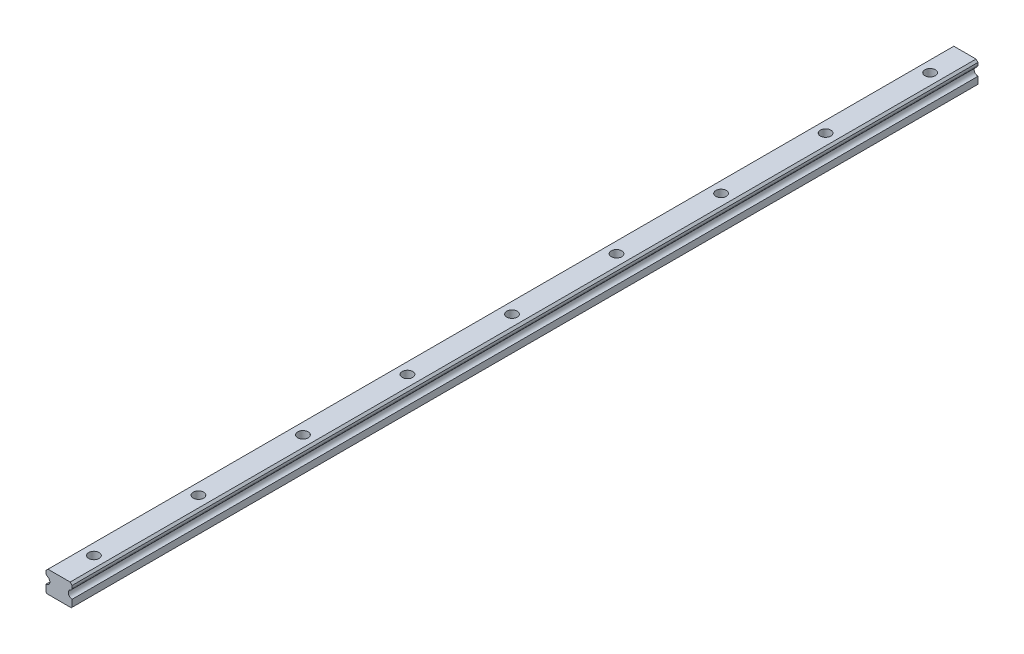
ISO-10303-21;
HEADER;
FILE_DESCRIPTION(('STEP AP214'),'2;1');
FILE_NAME('part.step','',(''),(''),'','','');
FILE_SCHEMA(('AUTOMOTIVE_DESIGN { 1 0 10303 214 1 1 1 1 }'));
ENDSEC;
DATA;
#1=APPLICATION_CONTEXT('core data for automotive mechanical design processes');
#2=APPLICATION_PROTOCOL_DEFINITION('international standard','automotive_design',2000,#1);
#3=PRODUCT_CONTEXT('',#1,'mechanical');
#4=PRODUCT('Part','Part','',(#3));
#5=PRODUCT_RELATED_PRODUCT_CATEGORY('part','',(#4));
#6=PRODUCT_DEFINITION_FORMATION('','',#4);
#7=PRODUCT_DEFINITION_CONTEXT('part definition',#1,'design');
#8=PRODUCT_DEFINITION('design','',#6,#7);
#9=PRODUCT_DEFINITION_SHAPE('','',#8);
#10=(LENGTH_UNIT() NAMED_UNIT(*) SI_UNIT(.MILLI.,.METRE.));
#11=(NAMED_UNIT(*) PLANE_ANGLE_UNIT() SI_UNIT($,.RADIAN.));
#12=(NAMED_UNIT(*) SI_UNIT($,.STERADIAN.) SOLID_ANGLE_UNIT());
#13=UNCERTAINTY_MEASURE_WITH_UNIT(LENGTH_MEASURE(1.E-05),#10,'distance_accuracy_value','');
#14=(GEOMETRIC_REPRESENTATION_CONTEXT(3) GLOBAL_UNCERTAINTY_ASSIGNED_CONTEXT((#13)) GLOBAL_UNIT_ASSIGNED_CONTEXT((#10,
#11,#12)) REPRESENTATION_CONTEXT('',''));
#15=CARTESIAN_POINT('',(0.,0.,0.));
#16=DIRECTION('',(0.,0.,1.));
#17=DIRECTION('',(1.,0.,0.));
#18=AXIS2_PLACEMENT_3D('',#15,#16,#17);
#19=CARTESIAN_POINT('',(-7.5,4.505,260.));
#20=DIRECTION('',(1.,0.,0.));
#21=DIRECTION('',(0.,0.,-1.));
#22=AXIS2_PLACEMENT_3D('',#19,#20,#21);
#23=PLANE('',#22);
#24=DIRECTION('',(0.,-1.,0.));
#25=VECTOR('',#24,1.);
#26=CARTESIAN_POINT('',(-7.5,4.505,-260.));
#27=LINE('',#26,#25);
#28=CARTESIAN_POINT('',(-7.5,4.505,-260.));
#29=VERTEX_POINT('',#28);
#30=CARTESIAN_POINT('',(-7.5,0.5,-260.));
#31=VERTEX_POINT('',#30);
#32=EDGE_CURVE('E131',#29,#31,#27,.T.);
#33=ORIENTED_EDGE('',*,*,#32,.T.);
#34=DIRECTION('',(0.,0.,-1.));
#35=VECTOR('',#34,1.);
#36=CARTESIAN_POINT('',(-7.5,0.5,260.));
#37=LINE('',#36,#35);
#38=CARTESIAN_POINT('',(-7.5,0.5,260.));
#39=VERTEX_POINT('',#38);
#40=EDGE_CURVE('E120',#39,#31,#37,.T.);
#41=ORIENTED_EDGE('',*,*,#40,.F.);
#42=DIRECTION('',(0.,-1.,0.));
#43=VECTOR('',#42,1.);
#44=CARTESIAN_POINT('',(-7.5,4.505,260.));
#45=LINE('',#44,#43);
#46=CARTESIAN_POINT('',(-7.5,4.505,260.));
#47=VERTEX_POINT('',#46);
#48=EDGE_CURVE('E130',#47,#39,#45,.T.);
#49=ORIENTED_EDGE('',*,*,#48,.F.);
#50=DIRECTION('',(0.,0.,-1.));
#51=VECTOR('',#50,1.);
#52=CARTESIAN_POINT('',(-7.5,4.505,260.));
#53=LINE('',#52,#51);
#54=EDGE_CURVE('E143',#47,#29,#53,.T.);
#55=ORIENTED_EDGE('',*,*,#54,.T.);
#56=EDGE_LOOP('',(#33,#41,#49,#55));
#57=FACE_BOUND('',#56,.T.);
#58=ADVANCED_FACE('F16',(#57),#23,.F.);
#59=CARTESIAN_POINT('',(7.5,6.705,-260.));
#60=DIRECTION('',(0.,0.,1.));
#61=DIRECTION('',(1.,0.,0.));
#62=AXIS2_PLACEMENT_3D('',#59,#60,#61);
#63=PLANE('',#62);
#64=ORIENTED_EDGE('',*,*,#32,.F.);
#65=CARTESIAN_POINT('',(-7.5,6.705,-260.));
#66=DIRECTION('',(0.,0.,1.));
#67=DIRECTION('',(0.,-1.,0.));
#68=AXIS2_PLACEMENT_3D('',#65,#66,#67);
#69=CIRCLE('',#68,2.2);
#70=CARTESIAN_POINT('',(-6.6081080888441,8.7161013944639,-260.));
#71=VERTEX_POINT('',#70);
#72=EDGE_CURVE('E154',#29,#71,#69,.T.);
#73=ORIENTED_EDGE('',*,*,#72,.T.);
#74=CARTESIAN_POINT('',(-6.00000000000026,10.0873069050574,-260.));
#75=DIRECTION('',(0.,0.,1.));
#76=DIRECTION('',(-1.,4.13299024633863E-13,0.));
#77=AXIS2_PLACEMENT_3D('',#74,#75,#76);
#78=CIRCLE('',#77,1.49999999999974);
#79=CARTESIAN_POINT('',(-7.5,10.087306905058,-260.));
#80=VERTEX_POINT('',#79);
#81=EDGE_CURVE('E158',#80,#71,#78,.T.);
#82=ORIENTED_EDGE('',*,*,#81,.F.);
#83=DIRECTION('',(0.,-1.,0.));
#84=VECTOR('',#83,1.);
#85=CARTESIAN_POINT('',(-7.5,11.375700217913,-260.));
#86=LINE('',#85,#84);
#87=CARTESIAN_POINT('',(-7.5,11.375700217913,-260.));
#88=VERTEX_POINT('',#87);
#89=EDGE_CURVE('E162',#88,#80,#86,.T.);
#90=ORIENTED_EDGE('',*,*,#89,.F.);
#91=DIRECTION('',(-0.707106781186422,-0.707106781186673,0.));
#92=VECTOR('',#91,1.);
#93=CARTESIAN_POINT('',(-6.3757002179134,12.5,-260.));
#94=LINE('',#93,#92);
#95=CARTESIAN_POINT('',(-6.3757002179134,12.5,-260.));
#96=VERTEX_POINT('',#95);
#97=EDGE_CURVE('E166',#96,#88,#94,.T.);
#98=ORIENTED_EDGE('',*,*,#97,.F.);
#99=DIRECTION('',(-1.,0.,0.));
#100=VECTOR('',#99,1.);
#101=CARTESIAN_POINT('',(6.3757002179134,12.5,-260.));
#102=LINE('',#101,#100);
#103=CARTESIAN_POINT('',(6.3757002179134,12.5,-260.));
#104=VERTEX_POINT('',#103);
#105=EDGE_CURVE('E170',#104,#96,#102,.T.);
#106=ORIENTED_EDGE('',*,*,#105,.F.);
#107=DIRECTION('',(-0.707106781186422,0.707106781186673,0.));
#108=VECTOR('',#107,1.);
#109=CARTESIAN_POINT('',(7.5,11.375700217913,-260.));
#110=LINE('',#109,#108);
#111=CARTESIAN_POINT('',(7.5,11.375700217913,-260.));
#112=VERTEX_POINT('',#111);
#113=EDGE_CURVE('E174',#112,#104,#110,.T.);
#114=ORIENTED_EDGE('',*,*,#113,.F.);
#115=DIRECTION('',(0.,1.,0.));
#116=VECTOR('',#115,1.);
#117=CARTESIAN_POINT('',(7.5,10.087306905058,-260.));
#118=LINE('',#117,#116);
#119=CARTESIAN_POINT('',(7.5,10.087306905058,-260.));
#120=VERTEX_POINT('',#119);
#121=EDGE_CURVE('E178',#120,#112,#118,.T.);
#122=ORIENTED_EDGE('',*,*,#121,.F.);
#123=CARTESIAN_POINT('',(6.00000000000021,10.0873069050574,-260.));
#124=DIRECTION('',(0.,0.,1.));
#125=DIRECTION('',(0.405405379719981,-0.914137012757988,0.));
#126=AXIS2_PLACEMENT_3D('',#123,#124,#125);
#127=CIRCLE('',#126,1.49999999999979);
#128=CARTESIAN_POINT('',(6.6081080695801,8.7161013859206,-260.));
#129=VERTEX_POINT('',#128);
#130=EDGE_CURVE('E182',#129,#120,#127,.T.);
#131=ORIENTED_EDGE('',*,*,#130,.F.);
#132=CARTESIAN_POINT('',(7.5,6.705,-260.));
#133=DIRECTION('',(0.,0.,1.));
#134=DIRECTION('',(-0.40540542291814,0.914136993600283,0.));
#135=AXIS2_PLACEMENT_3D('',#132,#133,#134);
#136=CIRCLE('',#135,2.2);
#137=CARTESIAN_POINT('',(7.5,4.505,-260.));
#138=VERTEX_POINT('',#137);
#139=EDGE_CURVE('E186',#129,#138,#136,.T.);
#140=ORIENTED_EDGE('',*,*,#139,.T.);
#141=DIRECTION('',(0.,1.,0.));
#142=VECTOR('',#141,1.);
#143=CARTESIAN_POINT('',(7.5,0.5,-260.));
#144=LINE('',#143,#142);
#145=CARTESIAN_POINT('',(7.5,0.5,-260.));
#146=VERTEX_POINT('',#145);
#147=EDGE_CURVE('E191',#146,#138,#144,.T.);
#148=ORIENTED_EDGE('',*,*,#147,.F.);
#149=DIRECTION('',(0.707106781186547,0.707106781186548,0.));
#150=VECTOR('',#149,1.);
#151=CARTESIAN_POINT('',(7.,0.,-260.));
#152=LINE('',#151,#150);
#153=CARTESIAN_POINT('',(7.,0.,-260.));
#154=VERTEX_POINT('',#153);
#155=EDGE_CURVE('E195',#154,#146,#152,.T.);
#156=ORIENTED_EDGE('',*,*,#155,.F.);
#157=DIRECTION('',(1.,0.,0.));
#158=VECTOR('',#157,1.);
#159=CARTESIAN_POINT('',(-7.,0.,-260.));
#160=LINE('',#159,#158);
#161=CARTESIAN_POINT('',(-7.,0.,-260.));
#162=VERTEX_POINT('',#161);
#163=EDGE_CURVE('E139',#162,#154,#160,.T.);
#164=ORIENTED_EDGE('',*,*,#163,.F.);
#165=DIRECTION('',(0.707106781186547,-0.707106781186548,0.));
#166=VECTOR('',#165,1.);
#167=CARTESIAN_POINT('',(-7.5,0.5,-260.));
#168=LINE('',#167,#166);
#169=EDGE_CURVE('E124',#31,#162,#168,.T.);
#170=ORIENTED_EDGE('',*,*,#169,.F.);
#171=EDGE_LOOP('',(#64,#73,#82,#90,#98,#106,#114,#122,#131,#140,#148,#156,#164,#170));
#172=FACE_BOUND('',#171,.T.);
#173=ADVANCED_FACE('F136',(#172),#63,.F.);
#174=CARTESIAN_POINT('',(-7.5,0.5,260.));
#175=DIRECTION('',(0.707106781186548,0.707106781186547,0.));
#176=DIRECTION('',(-0.707106781186547,0.707106781186548,0.));
#177=AXIS2_PLACEMENT_3D('',#174,#175,#176);
#178=PLANE('',#177);
#179=ORIENTED_EDGE('',*,*,#169,.T.);
#180=DIRECTION('',(0.,0.,-1.));
#181=VECTOR('',#180,1.);
#182=CARTESIAN_POINT('',(-7.,0.,260.));
#183=LINE('',#182,#181);
#184=CARTESIAN_POINT('',(-7.,0.,260.));
#185=VERTEX_POINT('',#184);
#186=EDGE_CURVE('E140',#185,#162,#183,.T.);
#187=ORIENTED_EDGE('',*,*,#186,.F.);
#188=DIRECTION('',(0.707106781186547,-0.707106781186548,0.));
#189=VECTOR('',#188,1.);
#190=CARTESIAN_POINT('',(-7.5,0.5,260.));
#191=LINE('',#190,#189);
#192=EDGE_CURVE('E126',#39,#185,#191,.T.);
#193=ORIENTED_EDGE('',*,*,#192,.F.);
#194=ORIENTED_EDGE('',*,*,#40,.T.);
#195=EDGE_LOOP('',(#179,#187,#193,#194));
#196=FACE_BOUND('',#195,.T.);
#197=ADVANCED_FACE('F122',(#196),#178,.F.);
#198=CARTESIAN_POINT('',(7.5,6.705,260.));
#199=DIRECTION('',(0.,0.,1.));
#200=DIRECTION('',(1.,0.,0.));
#201=AXIS2_PLACEMENT_3D('',#198,#199,#200);
#202=PLANE('',#201);
#203=ORIENTED_EDGE('',*,*,#48,.T.);
#204=ORIENTED_EDGE('',*,*,#192,.T.);
#205=DIRECTION('',(1.,0.,0.));
#206=VECTOR('',#205,1.);
#207=CARTESIAN_POINT('',(-7.,0.,260.));
#208=LINE('',#207,#206);
#209=CARTESIAN_POINT('',(7.,0.,260.));
#210=VERTEX_POINT('',#209);
#211=EDGE_CURVE('E210',#185,#210,#208,.T.);
#212=ORIENTED_EDGE('',*,*,#211,.T.);
#213=DIRECTION('',(0.707106781186547,0.707106781186548,0.));
#214=VECTOR('',#213,1.);
#215=CARTESIAN_POINT('',(7.,0.,260.));
#216=LINE('',#215,#214);
#217=CARTESIAN_POINT('',(7.5,0.5,260.));
#218=VERTEX_POINT('',#217);
#219=EDGE_CURVE('E215',#210,#218,#216,.T.);
#220=ORIENTED_EDGE('',*,*,#219,.T.);
#221=DIRECTION('',(0.,1.,0.));
#222=VECTOR('',#221,1.);
#223=CARTESIAN_POINT('',(7.5,0.5,260.));
#224=LINE('',#223,#222);
#225=CARTESIAN_POINT('',(7.5,4.505,260.));
#226=VERTEX_POINT('',#225);
#227=EDGE_CURVE('E220',#218,#226,#224,.T.);
#228=ORIENTED_EDGE('',*,*,#227,.T.);
#229=CARTESIAN_POINT('',(7.5,6.705,260.));
#230=DIRECTION('',(0.,0.,1.));
#231=DIRECTION('',(-0.40540542291814,0.914136993600283,0.));
#232=AXIS2_PLACEMENT_3D('',#229,#230,#231);
#233=CIRCLE('',#232,2.2);
#234=CARTESIAN_POINT('',(6.6081080695801,8.7161013859206,260.));
#235=VERTEX_POINT('',#234);
#236=EDGE_CURVE('E225',#235,#226,#233,.T.);
#237=ORIENTED_EDGE('',*,*,#236,.F.);
#238=CARTESIAN_POINT('',(6.00000000000021,10.0873069050574,260.));
#239=DIRECTION('',(0.,0.,1.));
#240=DIRECTION('',(0.405405379719981,-0.914137012757988,0.));
#241=AXIS2_PLACEMENT_3D('',#238,#239,#240);
#242=CIRCLE('',#241,1.49999999999979);
#243=CARTESIAN_POINT('',(7.5,10.087306905058,260.));
#244=VERTEX_POINT('',#243);
#245=EDGE_CURVE('E230',#235,#244,#242,.T.);
#246=ORIENTED_EDGE('',*,*,#245,.T.);
#247=DIRECTION('',(0.,1.,0.));
#248=VECTOR('',#247,1.);
#249=CARTESIAN_POINT('',(7.5,10.087306905058,260.));
#250=LINE('',#249,#248);
#251=CARTESIAN_POINT('',(7.5,11.375700217913,260.));
#252=VERTEX_POINT('',#251);
#253=EDGE_CURVE('E235',#244,#252,#250,.T.);
#254=ORIENTED_EDGE('',*,*,#253,.T.);
#255=DIRECTION('',(-0.707106781186422,0.707106781186673,0.));
#256=VECTOR('',#255,1.);
#257=CARTESIAN_POINT('',(7.5,11.375700217913,260.));
#258=LINE('',#257,#256);
#259=CARTESIAN_POINT('',(6.3757002179134,12.5,260.));
#260=VERTEX_POINT('',#259);
#261=EDGE_CURVE('E240',#252,#260,#258,.T.);
#262=ORIENTED_EDGE('',*,*,#261,.T.);
#263=DIRECTION('',(-1.,0.,0.));
#264=VECTOR('',#263,1.);
#265=CARTESIAN_POINT('',(6.3757002179134,12.5,260.));
#266=LINE('',#265,#264);
#267=CARTESIAN_POINT('',(-6.3757002179134,12.5,260.));
#268=VERTEX_POINT('',#267);
#269=EDGE_CURVE('E245',#260,#268,#266,.T.);
#270=ORIENTED_EDGE('',*,*,#269,.T.);
#271=DIRECTION('',(-0.707106781186422,-0.707106781186673,0.));
#272=VECTOR('',#271,1.);
#273=CARTESIAN_POINT('',(-6.3757002179134,12.5,260.));
#274=LINE('',#273,#272);
#275=CARTESIAN_POINT('',(-7.5,11.375700217913,260.));
#276=VERTEX_POINT('',#275);
#277=EDGE_CURVE('E250',#268,#276,#274,.T.);
#278=ORIENTED_EDGE('',*,*,#277,.T.);
#279=DIRECTION('',(0.,-1.,0.));
#280=VECTOR('',#279,1.);
#281=CARTESIAN_POINT('',(-7.5,11.375700217913,260.));
#282=LINE('',#281,#280);
#283=CARTESIAN_POINT('',(-7.5,10.087306905058,260.));
#284=VERTEX_POINT('',#283);
#285=EDGE_CURVE('E255',#276,#284,#282,.T.);
#286=ORIENTED_EDGE('',*,*,#285,.T.);
#287=CARTESIAN_POINT('',(-6.00000000000026,10.0873069050574,260.));
#288=DIRECTION('',(0.,0.,1.));
#289=DIRECTION('',(-1.,4.13299024633863E-13,0.));
#290=AXIS2_PLACEMENT_3D('',#287,#288,#289);
#291=CIRCLE('',#290,1.49999999999974);
#292=CARTESIAN_POINT('',(-6.6081080888441,8.7161013944639,260.));
#293=VERTEX_POINT('',#292);
#294=EDGE_CURVE('E259',#284,#293,#291,.T.);
#295=ORIENTED_EDGE('',*,*,#294,.T.);
#296=CARTESIAN_POINT('',(-7.5,6.705,260.));
#297=DIRECTION('',(0.,0.,1.));
#298=DIRECTION('',(0.,-1.,0.));
#299=AXIS2_PLACEMENT_3D('',#296,#297,#298);
#300=CIRCLE('',#299,2.2);
#301=EDGE_CURVE('E263',#47,#293,#300,.T.);
#302=ORIENTED_EDGE('',*,*,#301,.F.);
#303=EDGE_LOOP('',(#203,#204,#212,#220,#228,#237,#246,#254,#262,#270,#278,#286,#295,#302));
#304=FACE_BOUND('',#303,.T.);
#305=ADVANCED_FACE('F454',(#304),#202,.T.);
#306=CARTESIAN_POINT('',(-7.5,6.705,260.));
#307=DIRECTION('',(0.,0.,-1.));
#308=DIRECTION('',(-1.,0.,0.));
#309=AXIS2_PLACEMENT_3D('',#306,#307,#308);
#310=CYLINDRICAL_SURFACE('',#309,2.2);
#311=ORIENTED_EDGE('',*,*,#72,.F.);
#312=ORIENTED_EDGE('',*,*,#54,.F.);
#313=ORIENTED_EDGE('',*,*,#301,.T.);
#314=DIRECTION('',(0.,0.,-1.));
#315=VECTOR('',#314,1.);
#316=CARTESIAN_POINT('',(-6.6081080888441,8.7161013944639,260.));
#317=LINE('',#316,#315);
#318=EDGE_CURVE('E31',#293,#71,#317,.T.);
#319=ORIENTED_EDGE('',*,*,#318,.T.);
#320=EDGE_LOOP('',(#311,#312,#313,#319));
#321=FACE_BOUND('',#320,.T.);
#322=ADVANCED_FACE('F457',(#321),#310,.F.);
#323=CARTESIAN_POINT('',(-6.00000000000026,10.0873069050574,260.));
#324=DIRECTION('',(0.,0.,-1.));
#325=DIRECTION('',(-1.,0.,0.));
#326=AXIS2_PLACEMENT_3D('',#323,#324,#325);
#327=CYLINDRICAL_SURFACE('',#326,1.49999999999974);
#328=ORIENTED_EDGE('',*,*,#81,.T.);
#329=ORIENTED_EDGE('',*,*,#318,.F.);
#330=ORIENTED_EDGE('',*,*,#294,.F.);
#331=DIRECTION('',(0.,0.,-1.));
#332=VECTOR('',#331,1.);
#333=CARTESIAN_POINT('',(-7.5,10.087306905058,260.));
#334=LINE('',#333,#332);
#335=EDGE_CURVE('E39',#284,#80,#334,.T.);
#336=ORIENTED_EDGE('',*,*,#335,.T.);
#337=EDGE_LOOP('',(#328,#329,#330,#336));
#338=FACE_BOUND('',#337,.T.);
#339=ADVANCED_FACE('F461',(#338),#327,.T.);
#340=CARTESIAN_POINT('',(-7.5,11.375700217913,260.));
#341=DIRECTION('',(1.,0.,0.));
#342=DIRECTION('',(0.,0.,-1.));
#343=AXIS2_PLACEMENT_3D('',#340,#341,#342);
#344=PLANE('',#343);
#345=ORIENTED_EDGE('',*,*,#89,.T.);
#346=ORIENTED_EDGE('',*,*,#335,.F.);
#347=ORIENTED_EDGE('',*,*,#285,.F.);
#348=DIRECTION('',(0.,0.,-1.));
#349=VECTOR('',#348,1.);
#350=CARTESIAN_POINT('',(-7.5,11.375700217913,260.));
#351=LINE('',#350,#349);
#352=EDGE_CURVE('E274',#276,#88,#351,.T.);
#353=ORIENTED_EDGE('',*,*,#352,.T.);
#354=EDGE_LOOP('',(#345,#346,#347,#353));
#355=FACE_BOUND('',#354,.T.);
#356=ADVANCED_FACE('F465',(#355),#344,.F.);
#357=CARTESIAN_POINT('',(-6.3757002179134,12.5,260.));
#358=DIRECTION('',(0.707106781186674,-0.707106781186422,0.));
#359=DIRECTION('',(0.707106781186422,0.707106781186674,0.));
#360=AXIS2_PLACEMENT_3D('',#357,#358,#359);
#361=PLANE('',#360);
#362=ORIENTED_EDGE('',*,*,#97,.T.);
#363=ORIENTED_EDGE('',*,*,#352,.F.);
#364=ORIENTED_EDGE('',*,*,#277,.F.);
#365=DIRECTION('',(0.,0.,-1.));
#366=VECTOR('',#365,1.);
#367=CARTESIAN_POINT('',(-6.3757002179134,12.5,260.));
#368=LINE('',#367,#366);
#369=EDGE_CURVE('E279',#268,#96,#368,.T.);
#370=ORIENTED_EDGE('',*,*,#369,.T.);
#371=EDGE_LOOP('',(#362,#363,#364,#370));
#372=FACE_BOUND('',#371,.T.);
#373=ADVANCED_FACE('F468',(#372),#361,.F.);
#374=CARTESIAN_POINT('',(6.3757002179134,12.5,260.));
#375=DIRECTION('',(0.,-1.,0.));
#376=DIRECTION('',(0.,0.,-1.));
#377=AXIS2_PLACEMENT_3D('',#374,#375,#376);
#378=PLANE('',#377);
#379=CARTESIAN_POINT('',(0.,12.5,-180.));
#380=DIRECTION('',(0.,-1.,0.));
#381=DIRECTION('',(0.,0.,-1.));
#382=AXIS2_PLACEMENT_3D('',#379,#380,#381);
#383=CIRCLE('',#382,3.);
#384=CARTESIAN_POINT('',(0.,12.5,-183.));
#385=VERTEX_POINT('',#384);
#386=EDGE_CURVE('E284',#385,#385,#383,.T.);
#387=ORIENTED_EDGE('',*,*,#386,.T.);
#388=EDGE_LOOP('',(#387));
#389=FACE_BOUND('',#388,.T.);
#390=CARTESIAN_POINT('',(0.,12.5,-120.));
#391=DIRECTION('',(0.,-1.,0.));
#392=DIRECTION('',(0.,0.,-1.));
#393=AXIS2_PLACEMENT_3D('',#390,#391,#392);
#394=CIRCLE('',#393,3.);
#395=CARTESIAN_POINT('',(0.,12.5,-123.));
#396=VERTEX_POINT('',#395);
#397=EDGE_CURVE('E289',#396,#396,#394,.T.);
#398=ORIENTED_EDGE('',*,*,#397,.T.);
#399=EDGE_LOOP('',(#398));
#400=FACE_BOUND('',#399,.T.);
#401=CARTESIAN_POINT('',(0.,12.5,-60.));
#402=DIRECTION('',(0.,-1.,0.));
#403=DIRECTION('',(0.,0.,-1.));
#404=AXIS2_PLACEMENT_3D('',#401,#402,#403);
#405=CIRCLE('',#404,3.);
#406=CARTESIAN_POINT('',(0.,12.5,-63.));
#407=VERTEX_POINT('',#406);
#408=EDGE_CURVE('E292',#407,#407,#405,.T.);
#409=ORIENTED_EDGE('',*,*,#408,.T.);
#410=EDGE_LOOP('',(#409));
#411=FACE_BOUND('',#410,.T.);
#412=CARTESIAN_POINT('',(0.,12.5,0.));
#413=DIRECTION('',(0.,-1.,0.));
#414=DIRECTION('',(0.,0.,-1.));
#415=AXIS2_PLACEMENT_3D('',#412,#413,#414);
#416=CIRCLE('',#415,3.);
#417=CARTESIAN_POINT('',(0.,12.5,-3.));
#418=VERTEX_POINT('',#417);
#419=EDGE_CURVE('E295',#418,#418,#416,.T.);
#420=ORIENTED_EDGE('',*,*,#419,.T.);
#421=EDGE_LOOP('',(#420));
#422=FACE_BOUND('',#421,.T.);
#423=CARTESIAN_POINT('',(0.,12.5,60.));
#424=DIRECTION('',(0.,-1.,0.));
#425=DIRECTION('',(0.,0.,-1.));
#426=AXIS2_PLACEMENT_3D('',#423,#424,#425);
#427=CIRCLE('',#426,3.);
#428=CARTESIAN_POINT('',(0.,12.5,57.));
#429=VERTEX_POINT('',#428);
#430=EDGE_CURVE('E298',#429,#429,#427,.T.);
#431=ORIENTED_EDGE('',*,*,#430,.T.);
#432=EDGE_LOOP('',(#431));
#433=FACE_BOUND('',#432,.T.);
#434=CARTESIAN_POINT('',(0.,12.5,120.));
#435=DIRECTION('',(0.,-1.,0.));
#436=DIRECTION('',(0.,0.,-1.));
#437=AXIS2_PLACEMENT_3D('',#434,#435,#436);
#438=CIRCLE('',#437,3.);
#439=CARTESIAN_POINT('',(0.,12.5,117.));
#440=VERTEX_POINT('',#439);
#441=EDGE_CURVE('E301',#440,#440,#438,.T.);
#442=ORIENTED_EDGE('',*,*,#441,.T.);
#443=EDGE_LOOP('',(#442));
#444=FACE_BOUND('',#443,.T.);
#445=CARTESIAN_POINT('',(0.,12.5,180.));
#446=DIRECTION('',(0.,-1.,0.));
#447=DIRECTION('',(0.,0.,-1.));
#448=AXIS2_PLACEMENT_3D('',#445,#446,#447);
#449=CIRCLE('',#448,3.);
#450=CARTESIAN_POINT('',(0.,12.5,177.));
#451=VERTEX_POINT('',#450);
#452=EDGE_CURVE('E304',#451,#451,#449,.T.);
#453=ORIENTED_EDGE('',*,*,#452,.T.);
#454=EDGE_LOOP('',(#453));
#455=FACE_BOUND('',#454,.T.);
#456=CARTESIAN_POINT('',(0.,12.5,240.));
#457=DIRECTION('',(0.,-1.,0.));
#458=DIRECTION('',(0.,0.,-1.));
#459=AXIS2_PLACEMENT_3D('',#456,#457,#458);
#460=CIRCLE('',#459,3.);
#461=CARTESIAN_POINT('',(0.,12.5,237.));
#462=VERTEX_POINT('',#461);
#463=EDGE_CURVE('E307',#462,#462,#460,.T.);
#464=ORIENTED_EDGE('',*,*,#463,.T.);
#465=EDGE_LOOP('',(#464));
#466=FACE_BOUND('',#465,.T.);
#467=CARTESIAN_POINT('',(0.,12.5,-240.));
#468=DIRECTION('',(0.,-1.,0.));
#469=DIRECTION('',(0.,0.,-1.));
#470=AXIS2_PLACEMENT_3D('',#467,#468,#469);
#471=CIRCLE('',#470,3.);
#472=CARTESIAN_POINT('',(0.,12.5,-243.));
#473=VERTEX_POINT('',#472);
#474=EDGE_CURVE('E310',#473,#473,#471,.T.);
#475=ORIENTED_EDGE('',*,*,#474,.T.);
#476=EDGE_LOOP('',(#475));
#477=FACE_BOUND('',#476,.T.);
#478=ORIENTED_EDGE('',*,*,#105,.T.);
#479=ORIENTED_EDGE('',*,*,#369,.F.);
#480=ORIENTED_EDGE('',*,*,#269,.F.);
#481=DIRECTION('',(0.,0.,-1.));
#482=VECTOR('',#481,1.);
#483=CARTESIAN_POINT('',(6.3757002179134,12.5,260.));
#484=LINE('',#483,#482);
#485=EDGE_CURVE('E313',#260,#104,#484,.T.);
#486=ORIENTED_EDGE('',*,*,#485,.T.);
#487=EDGE_LOOP('',(#478,#479,#480,#486));
#488=FACE_BOUND('',#487,.T.);
#489=ADVANCED_FACE('F471',(#389,#400,#411,#422,#433,#444,#455,#466,#477,#488),#378,.F.);
#490=CARTESIAN_POINT('',(7.5,11.375700217913,260.));
#491=DIRECTION('',(-0.707106781186674,-0.707106781186422,0.));
#492=DIRECTION('',(0.707106781186422,-0.707106781186674,0.));
#493=AXIS2_PLACEMENT_3D('',#490,#491,#492);
#494=PLANE('',#493);
#495=ORIENTED_EDGE('',*,*,#113,.T.);
#496=ORIENTED_EDGE('',*,*,#485,.F.);
#497=ORIENTED_EDGE('',*,*,#261,.F.);
#498=DIRECTION('',(0.,0.,-1.));
#499=VECTOR('',#498,1.);
#500=CARTESIAN_POINT('',(7.5,11.375700217913,260.));
#501=LINE('',#500,#499);
#502=EDGE_CURVE('E316',#252,#112,#501,.T.);
#503=ORIENTED_EDGE('',*,*,#502,.T.);
#504=EDGE_LOOP('',(#495,#496,#497,#503));
#505=FACE_BOUND('',#504,.T.);
#506=ADVANCED_FACE('F475',(#505),#494,.F.);
#507=CARTESIAN_POINT('',(7.5,10.087306905058,260.));
#508=DIRECTION('',(-1.,0.,0.));
#509=DIRECTION('',(0.,0.,1.));
#510=AXIS2_PLACEMENT_3D('',#507,#508,#509);
#511=PLANE('',#510);
#512=ORIENTED_EDGE('',*,*,#121,.T.);
#513=ORIENTED_EDGE('',*,*,#502,.F.);
#514=ORIENTED_EDGE('',*,*,#253,.F.);
#515=DIRECTION('',(0.,0.,-1.));
#516=VECTOR('',#515,1.);
#517=CARTESIAN_POINT('',(7.5,10.087306905058,260.));
#518=LINE('',#517,#516);
#519=EDGE_CURVE('E321',#244,#120,#518,.T.);
#520=ORIENTED_EDGE('',*,*,#519,.T.);
#521=EDGE_LOOP('',(#512,#513,#514,#520));
#522=FACE_BOUND('',#521,.T.);
#523=ADVANCED_FACE('F479',(#522),#511,.F.);
#524=CARTESIAN_POINT('',(6.00000000000021,10.0873069050574,260.));
#525=DIRECTION('',(0.,0.,-1.));
#526=DIRECTION('',(-1.,0.,0.));
#527=AXIS2_PLACEMENT_3D('',#524,#525,#526);
#528=CYLINDRICAL_SURFACE('',#527,1.49999999999979);
#529=ORIENTED_EDGE('',*,*,#130,.T.);
#530=ORIENTED_EDGE('',*,*,#519,.F.);
#531=ORIENTED_EDGE('',*,*,#245,.F.);
#532=DIRECTION('',(0.,0.,-1.));
#533=VECTOR('',#532,1.);
#534=CARTESIAN_POINT('',(6.6081080695801,8.7161013859206,260.));
#535=LINE('',#534,#533);
#536=EDGE_CURVE('E326',#235,#129,#535,.T.);
#537=ORIENTED_EDGE('',*,*,#536,.T.);
#538=EDGE_LOOP('',(#529,#530,#531,#537));
#539=FACE_BOUND('',#538,.T.);
#540=ADVANCED_FACE('F483',(#539),#528,.T.);
#541=CARTESIAN_POINT('',(7.5,6.705,260.));
#542=DIRECTION('',(0.,0.,-1.));
#543=DIRECTION('',(-1.,0.,0.));
#544=AXIS2_PLACEMENT_3D('',#541,#542,#543);
#545=CYLINDRICAL_SURFACE('',#544,2.2);
#546=ORIENTED_EDGE('',*,*,#139,.F.);
#547=ORIENTED_EDGE('',*,*,#536,.F.);
#548=ORIENTED_EDGE('',*,*,#236,.T.);
#549=DIRECTION('',(0.,0.,-1.));
#550=VECTOR('',#549,1.);
#551=CARTESIAN_POINT('',(7.5,4.505,260.));
#552=LINE('',#551,#550);
#553=EDGE_CURVE('E331',#226,#138,#552,.T.);
#554=ORIENTED_EDGE('',*,*,#553,.T.);
#555=EDGE_LOOP('',(#546,#547,#548,#554));
#556=FACE_BOUND('',#555,.T.);
#557=ADVANCED_FACE('F487',(#556),#545,.F.);
#558=CARTESIAN_POINT('',(7.5,0.5,260.));
#559=DIRECTION('',(-1.,0.,0.));
#560=DIRECTION('',(0.,0.,1.));
#561=AXIS2_PLACEMENT_3D('',#558,#559,#560);
#562=PLANE('',#561);
#563=ORIENTED_EDGE('',*,*,#147,.T.);
#564=ORIENTED_EDGE('',*,*,#553,.F.);
#565=ORIENTED_EDGE('',*,*,#227,.F.);
#566=DIRECTION('',(0.,0.,-1.));
#567=VECTOR('',#566,1.);
#568=CARTESIAN_POINT('',(7.5,0.5,260.));
#569=LINE('',#568,#567);
#570=EDGE_CURVE('E336',#218,#146,#569,.T.);
#571=ORIENTED_EDGE('',*,*,#570,.T.);
#572=EDGE_LOOP('',(#563,#564,#565,#571));
#573=FACE_BOUND('',#572,.T.);
#574=ADVANCED_FACE('F491',(#573),#562,.F.);
#575=CARTESIAN_POINT('',(7.,0.,260.));
#576=DIRECTION('',(-0.707106781186548,0.707106781186547,0.));
#577=DIRECTION('',(-0.707106781186547,-0.707106781186548,0.));
#578=AXIS2_PLACEMENT_3D('',#575,#576,#577);
#579=PLANE('',#578);
#580=ORIENTED_EDGE('',*,*,#155,.T.);
#581=ORIENTED_EDGE('',*,*,#570,.F.);
#582=ORIENTED_EDGE('',*,*,#219,.F.);
#583=DIRECTION('',(0.,0.,-1.));
#584=VECTOR('',#583,1.);
#585=CARTESIAN_POINT('',(7.,0.,260.));
#586=LINE('',#585,#584);
#587=EDGE_CURVE('E341',#210,#154,#586,.T.);
#588=ORIENTED_EDGE('',*,*,#587,.T.);
#589=EDGE_LOOP('',(#580,#581,#582,#588));
#590=FACE_BOUND('',#589,.T.);
#591=ADVANCED_FACE('F495',(#590),#579,.F.);
#592=CARTESIAN_POINT('',(-7.,0.,260.));
#593=DIRECTION('',(0.,1.,0.));
#594=DIRECTION('',(0.,0.,1.));
#595=AXIS2_PLACEMENT_3D('',#592,#593,#594);
#596=PLANE('',#595);
#597=CARTESIAN_POINT('',(0.,0.,-180.));
#598=DIRECTION('',(0.,-1.,0.));
#599=DIRECTION('',(0.,0.,-1.));
#600=AXIS2_PLACEMENT_3D('',#597,#598,#599);
#601=CIRCLE('',#600,1.75);
#602=CARTESIAN_POINT('',(0.,0.,-181.75));
#603=VERTEX_POINT('',#602);
#604=EDGE_CURVE('E346',#603,#603,#601,.T.);
#605=ORIENTED_EDGE('',*,*,#604,.F.);
#606=EDGE_LOOP('',(#605));
#607=FACE_BOUND('',#606,.T.);
#608=CARTESIAN_POINT('',(0.,0.,-120.));
#609=DIRECTION('',(0.,-1.,0.));
#610=DIRECTION('',(0.,0.,-1.));
#611=AXIS2_PLACEMENT_3D('',#608,#609,#610);
#612=CIRCLE('',#611,1.75);
#613=CARTESIAN_POINT('',(0.,0.,-121.75));
#614=VERTEX_POINT('',#613);
#615=EDGE_CURVE('E351',#614,#614,#612,.T.);
#616=ORIENTED_EDGE('',*,*,#615,.F.);
#617=EDGE_LOOP('',(#616));
#618=FACE_BOUND('',#617,.T.);
#619=CARTESIAN_POINT('',(0.,0.,-60.));
#620=DIRECTION('',(0.,-1.,0.));
#621=DIRECTION('',(0.,0.,-1.));
#622=AXIS2_PLACEMENT_3D('',#619,#620,#621);
#623=CIRCLE('',#622,1.75);
#624=CARTESIAN_POINT('',(0.,0.,-61.75));
#625=VERTEX_POINT('',#624);
#626=EDGE_CURVE('E354',#625,#625,#623,.T.);
#627=ORIENTED_EDGE('',*,*,#626,.F.);
#628=EDGE_LOOP('',(#627));
#629=FACE_BOUND('',#628,.T.);
#630=CARTESIAN_POINT('',(0.,0.,0.));
#631=DIRECTION('',(0.,-1.,0.));
#632=DIRECTION('',(0.,0.,-1.));
#633=AXIS2_PLACEMENT_3D('',#630,#631,#632);
#634=CIRCLE('',#633,1.75);
#635=CARTESIAN_POINT('',(0.,0.,-1.75));
#636=VERTEX_POINT('',#635);
#637=EDGE_CURVE('E357',#636,#636,#634,.T.);
#638=ORIENTED_EDGE('',*,*,#637,.F.);
#639=EDGE_LOOP('',(#638));
#640=FACE_BOUND('',#639,.T.);
#641=CARTESIAN_POINT('',(0.,0.,60.));
#642=DIRECTION('',(0.,-1.,0.));
#643=DIRECTION('',(0.,0.,-1.));
#644=AXIS2_PLACEMENT_3D('',#641,#642,#643);
#645=CIRCLE('',#644,1.75);
#646=CARTESIAN_POINT('',(0.,0.,58.25));
#647=VERTEX_POINT('',#646);
#648=EDGE_CURVE('E360',#647,#647,#645,.T.);
#649=ORIENTED_EDGE('',*,*,#648,.F.);
#650=EDGE_LOOP('',(#649));
#651=FACE_BOUND('',#650,.T.);
#652=CARTESIAN_POINT('',(0.,0.,120.));
#653=DIRECTION('',(0.,-1.,0.));
#654=DIRECTION('',(0.,0.,-1.));
#655=AXIS2_PLACEMENT_3D('',#652,#653,#654);
#656=CIRCLE('',#655,1.75);
#657=CARTESIAN_POINT('',(0.,0.,118.25));
#658=VERTEX_POINT('',#657);
#659=EDGE_CURVE('E363',#658,#658,#656,.T.);
#660=ORIENTED_EDGE('',*,*,#659,.F.);
#661=EDGE_LOOP('',(#660));
#662=FACE_BOUND('',#661,.T.);
#663=CARTESIAN_POINT('',(0.,0.,180.));
#664=DIRECTION('',(0.,-1.,0.));
#665=DIRECTION('',(0.,0.,-1.));
#666=AXIS2_PLACEMENT_3D('',#663,#664,#665);
#667=CIRCLE('',#666,1.75);
#668=CARTESIAN_POINT('',(0.,0.,178.25));
#669=VERTEX_POINT('',#668);
#670=EDGE_CURVE('E366',#669,#669,#667,.T.);
#671=ORIENTED_EDGE('',*,*,#670,.F.);
#672=EDGE_LOOP('',(#671));
#673=FACE_BOUND('',#672,.T.);
#674=CARTESIAN_POINT('',(0.,0.,240.));
#675=DIRECTION('',(0.,-1.,0.));
#676=DIRECTION('',(0.,0.,-1.));
#677=AXIS2_PLACEMENT_3D('',#674,#675,#676);
#678=CIRCLE('',#677,1.75);
#679=CARTESIAN_POINT('',(0.,0.,238.25));
#680=VERTEX_POINT('',#679);
#681=EDGE_CURVE('E369',#680,#680,#678,.T.);
#682=ORIENTED_EDGE('',*,*,#681,.F.);
#683=EDGE_LOOP('',(#682));
#684=FACE_BOUND('',#683,.T.);
#685=CARTESIAN_POINT('',(0.,0.,-240.));
#686=DIRECTION('',(0.,-1.,0.));
#687=DIRECTION('',(0.,0.,-1.));
#688=AXIS2_PLACEMENT_3D('',#685,#686,#687);
#689=CIRCLE('',#688,1.75);
#690=CARTESIAN_POINT('',(0.,0.,-241.75));
#691=VERTEX_POINT('',#690);
#692=EDGE_CURVE('E372',#691,#691,#689,.T.);
#693=ORIENTED_EDGE('',*,*,#692,.F.);
#694=EDGE_LOOP('',(#693));
#695=FACE_BOUND('',#694,.T.);
#696=ORIENTED_EDGE('',*,*,#163,.T.);
#697=ORIENTED_EDGE('',*,*,#587,.F.);
#698=ORIENTED_EDGE('',*,*,#211,.F.);
#699=ORIENTED_EDGE('',*,*,#186,.T.);
#700=EDGE_LOOP('',(#696,#697,#698,#699));
#701=FACE_BOUND('',#700,.T.);
#702=ADVANCED_FACE('F499',(#607,#618,#629,#640,#651,#662,#673,#684,#695,#701),#596,.F.);
#703=CARTESIAN_POINT('',(0.,0.,-180.));
#704=DIRECTION('',(0.,-1.,0.));
#705=DIRECTION('',(0.,0.,-1.));
#706=AXIS2_PLACEMENT_3D('',#703,#704,#705);
#707=CYLINDRICAL_SURFACE('',#706,3.);
#708=CARTESIAN_POINT('',(0.,8.,-180.));
#709=DIRECTION('',(0.,-1.,0.));
#710=DIRECTION('',(0.,0.,-1.));
#711=AXIS2_PLACEMENT_3D('',#708,#709,#710);
#712=CIRCLE('',#711,3.);
#713=CARTESIAN_POINT('',(0.,8.,-183.));
#714=VERTEX_POINT('',#713);
#715=EDGE_CURVE('E375',#714,#714,#712,.T.);
#716=ORIENTED_EDGE('',*,*,#715,.T.);
#717=EDGE_LOOP('',(#716));
#718=FACE_BOUND('',#717,.T.);
#719=ORIENTED_EDGE('',*,*,#386,.F.);
#720=EDGE_LOOP('',(#719));
#721=FACE_BOUND('',#720,.T.);
#722=ADVANCED_FACE('F503',(#718,#721),#707,.F.);
#723=CARTESIAN_POINT('',(0.,0.,-120.));
#724=DIRECTION('',(0.,-1.,0.));
#725=DIRECTION('',(0.,0.,-1.));
#726=AXIS2_PLACEMENT_3D('',#723,#724,#725);
#727=CYLINDRICAL_SURFACE('',#726,3.);
#728=CARTESIAN_POINT('',(0.,8.,-120.));
#729=DIRECTION('',(0.,-1.,0.));
#730=DIRECTION('',(0.,0.,-1.));
#731=AXIS2_PLACEMENT_3D('',#728,#729,#730);
#732=CIRCLE('',#731,3.);
#733=CARTESIAN_POINT('',(0.,8.,-123.));
#734=VERTEX_POINT('',#733);
#735=EDGE_CURVE('E378',#734,#734,#732,.T.);
#736=ORIENTED_EDGE('',*,*,#735,.T.);
#737=EDGE_LOOP('',(#736));
#738=FACE_BOUND('',#737,.T.);
#739=ORIENTED_EDGE('',*,*,#397,.F.);
#740=EDGE_LOOP('',(#739));
#741=FACE_BOUND('',#740,.T.);
#742=ADVANCED_FACE('F507',(#738,#741),#727,.F.);
#743=CARTESIAN_POINT('',(0.,0.,-60.));
#744=DIRECTION('',(0.,-1.,0.));
#745=DIRECTION('',(0.,0.,-1.));
#746=AXIS2_PLACEMENT_3D('',#743,#744,#745);
#747=CYLINDRICAL_SURFACE('',#746,3.);
#748=CARTESIAN_POINT('',(0.,8.,-60.));
#749=DIRECTION('',(0.,-1.,0.));
#750=DIRECTION('',(0.,0.,-1.));
#751=AXIS2_PLACEMENT_3D('',#748,#749,#750);
#752=CIRCLE('',#751,3.);
#753=CARTESIAN_POINT('',(0.,8.,-63.));
#754=VERTEX_POINT('',#753);
#755=EDGE_CURVE('E381',#754,#754,#752,.T.);
#756=ORIENTED_EDGE('',*,*,#755,.T.);
#757=EDGE_LOOP('',(#756));
#758=FACE_BOUND('',#757,.T.);
#759=ORIENTED_EDGE('',*,*,#408,.F.);
#760=EDGE_LOOP('',(#759));
#761=FACE_BOUND('',#760,.T.);
#762=ADVANCED_FACE('F511',(#758,#761),#747,.F.);
#763=CARTESIAN_POINT('',(0.,0.,0.));
#764=DIRECTION('',(0.,-1.,0.));
#765=DIRECTION('',(0.,0.,-1.));
#766=AXIS2_PLACEMENT_3D('',#763,#764,#765);
#767=CYLINDRICAL_SURFACE('',#766,3.);
#768=CARTESIAN_POINT('',(0.,8.,0.));
#769=DIRECTION('',(0.,-1.,0.));
#770=DIRECTION('',(0.,0.,-1.));
#771=AXIS2_PLACEMENT_3D('',#768,#769,#770);
#772=CIRCLE('',#771,3.);
#773=CARTESIAN_POINT('',(0.,8.,-3.));
#774=VERTEX_POINT('',#773);
#775=EDGE_CURVE('E384',#774,#774,#772,.T.);
#776=ORIENTED_EDGE('',*,*,#775,.T.);
#777=EDGE_LOOP('',(#776));
#778=FACE_BOUND('',#777,.T.);
#779=ORIENTED_EDGE('',*,*,#419,.F.);
#780=EDGE_LOOP('',(#779));
#781=FACE_BOUND('',#780,.T.);
#782=ADVANCED_FACE('F515',(#778,#781),#767,.F.);
#783=CARTESIAN_POINT('',(0.,0.,60.));
#784=DIRECTION('',(0.,-1.,0.));
#785=DIRECTION('',(0.,0.,-1.));
#786=AXIS2_PLACEMENT_3D('',#783,#784,#785);
#787=CYLINDRICAL_SURFACE('',#786,3.);
#788=CARTESIAN_POINT('',(0.,8.,60.));
#789=DIRECTION('',(0.,-1.,0.));
#790=DIRECTION('',(0.,0.,-1.));
#791=AXIS2_PLACEMENT_3D('',#788,#789,#790);
#792=CIRCLE('',#791,3.);
#793=CARTESIAN_POINT('',(0.,8.,57.));
#794=VERTEX_POINT('',#793);
#795=EDGE_CURVE('E387',#794,#794,#792,.T.);
#796=ORIENTED_EDGE('',*,*,#795,.T.);
#797=EDGE_LOOP('',(#796));
#798=FACE_BOUND('',#797,.T.);
#799=ORIENTED_EDGE('',*,*,#430,.F.);
#800=EDGE_LOOP('',(#799));
#801=FACE_BOUND('',#800,.T.);
#802=ADVANCED_FACE('F519',(#798,#801),#787,.F.);
#803=CARTESIAN_POINT('',(0.,0.,120.));
#804=DIRECTION('',(0.,-1.,0.));
#805=DIRECTION('',(0.,0.,-1.));
#806=AXIS2_PLACEMENT_3D('',#803,#804,#805);
#807=CYLINDRICAL_SURFACE('',#806,3.);
#808=CARTESIAN_POINT('',(0.,8.,120.));
#809=DIRECTION('',(0.,-1.,0.));
#810=DIRECTION('',(0.,0.,-1.));
#811=AXIS2_PLACEMENT_3D('',#808,#809,#810);
#812=CIRCLE('',#811,3.);
#813=CARTESIAN_POINT('',(0.,8.,117.));
#814=VERTEX_POINT('',#813);
#815=EDGE_CURVE('E390',#814,#814,#812,.T.);
#816=ORIENTED_EDGE('',*,*,#815,.T.);
#817=EDGE_LOOP('',(#816));
#818=FACE_BOUND('',#817,.T.);
#819=ORIENTED_EDGE('',*,*,#441,.F.);
#820=EDGE_LOOP('',(#819));
#821=FACE_BOUND('',#820,.T.);
#822=ADVANCED_FACE('F523',(#818,#821),#807,.F.);
#823=CARTESIAN_POINT('',(0.,0.,180.));
#824=DIRECTION('',(0.,-1.,0.));
#825=DIRECTION('',(0.,0.,-1.));
#826=AXIS2_PLACEMENT_3D('',#823,#824,#825);
#827=CYLINDRICAL_SURFACE('',#826,3.);
#828=CARTESIAN_POINT('',(0.,8.,180.));
#829=DIRECTION('',(0.,-1.,0.));
#830=DIRECTION('',(0.,0.,-1.));
#831=AXIS2_PLACEMENT_3D('',#828,#829,#830);
#832=CIRCLE('',#831,3.);
#833=CARTESIAN_POINT('',(0.,8.,177.));
#834=VERTEX_POINT('',#833);
#835=EDGE_CURVE('E393',#834,#834,#832,.T.);
#836=ORIENTED_EDGE('',*,*,#835,.T.);
#837=EDGE_LOOP('',(#836));
#838=FACE_BOUND('',#837,.T.);
#839=ORIENTED_EDGE('',*,*,#452,.F.);
#840=EDGE_LOOP('',(#839));
#841=FACE_BOUND('',#840,.T.);
#842=ADVANCED_FACE('F527',(#838,#841),#827,.F.);
#843=CARTESIAN_POINT('',(0.,0.,240.));
#844=DIRECTION('',(0.,-1.,0.));
#845=DIRECTION('',(0.,0.,-1.));
#846=AXIS2_PLACEMENT_3D('',#843,#844,#845);
#847=CYLINDRICAL_SURFACE('',#846,3.);
#848=CARTESIAN_POINT('',(0.,8.,240.));
#849=DIRECTION('',(0.,-1.,0.));
#850=DIRECTION('',(0.,0.,-1.));
#851=AXIS2_PLACEMENT_3D('',#848,#849,#850);
#852=CIRCLE('',#851,3.);
#853=CARTESIAN_POINT('',(0.,8.,237.));
#854=VERTEX_POINT('',#853);
#855=EDGE_CURVE('E396',#854,#854,#852,.T.);
#856=ORIENTED_EDGE('',*,*,#855,.T.);
#857=EDGE_LOOP('',(#856));
#858=FACE_BOUND('',#857,.T.);
#859=ORIENTED_EDGE('',*,*,#463,.F.);
#860=EDGE_LOOP('',(#859));
#861=FACE_BOUND('',#860,.T.);
#862=ADVANCED_FACE('F531',(#858,#861),#847,.F.);
#863=CARTESIAN_POINT('',(0.,0.,-240.));
#864=DIRECTION('',(0.,-1.,0.));
#865=DIRECTION('',(0.,0.,-1.));
#866=AXIS2_PLACEMENT_3D('',#863,#864,#865);
#867=CYLINDRICAL_SURFACE('',#866,3.);
#868=CARTESIAN_POINT('',(0.,8.,-240.));
#869=DIRECTION('',(0.,-1.,0.));
#870=DIRECTION('',(0.,0.,-1.));
#871=AXIS2_PLACEMENT_3D('',#868,#869,#870);
#872=CIRCLE('',#871,3.);
#873=CARTESIAN_POINT('',(0.,8.,-243.));
#874=VERTEX_POINT('',#873);
#875=EDGE_CURVE('E399',#874,#874,#872,.T.);
#876=ORIENTED_EDGE('',*,*,#875,.T.);
#877=EDGE_LOOP('',(#876));
#878=FACE_BOUND('',#877,.T.);
#879=ORIENTED_EDGE('',*,*,#474,.F.);
#880=EDGE_LOOP('',(#879));
#881=FACE_BOUND('',#880,.T.);
#882=ADVANCED_FACE('F535',(#878,#881),#867,.F.);
#883=CARTESIAN_POINT('',(0.,0.,-180.));
#884=DIRECTION('',(0.,-1.,0.));
#885=DIRECTION('',(0.,0.,-1.));
#886=AXIS2_PLACEMENT_3D('',#883,#884,#885);
#887=CYLINDRICAL_SURFACE('',#886,1.75);
#888=ORIENTED_EDGE('',*,*,#604,.T.);
#889=EDGE_LOOP('',(#888));
#890=FACE_BOUND('',#889,.T.);
#891=CARTESIAN_POINT('',(0.,8.,-180.));
#892=DIRECTION('',(0.,-1.,0.));
#893=DIRECTION('',(0.,0.,-1.));
#894=AXIS2_PLACEMENT_3D('',#891,#892,#893);
#895=CIRCLE('',#894,1.75);
#896=CARTESIAN_POINT('',(0.,8.,-181.75));
#897=VERTEX_POINT('',#896);
#898=EDGE_CURVE('E402',#897,#897,#895,.T.);
#899=ORIENTED_EDGE('',*,*,#898,.F.);
#900=EDGE_LOOP('',(#899));
#901=FACE_BOUND('',#900,.T.);
#902=ADVANCED_FACE('F539',(#890,#901),#887,.F.);
#903=CARTESIAN_POINT('',(0.,0.,-120.));
#904=DIRECTION('',(0.,-1.,0.));
#905=DIRECTION('',(0.,0.,-1.));
#906=AXIS2_PLACEMENT_3D('',#903,#904,#905);
#907=CYLINDRICAL_SURFACE('',#906,1.75);
#908=ORIENTED_EDGE('',*,*,#615,.T.);
#909=EDGE_LOOP('',(#908));
#910=FACE_BOUND('',#909,.T.);
#911=CARTESIAN_POINT('',(0.,8.,-120.));
#912=DIRECTION('',(0.,-1.,0.));
#913=DIRECTION('',(0.,0.,-1.));
#914=AXIS2_PLACEMENT_3D('',#911,#912,#913);
#915=CIRCLE('',#914,1.75);
#916=CARTESIAN_POINT('',(0.,8.,-121.75));
#917=VERTEX_POINT('',#916);
#918=EDGE_CURVE('E405',#917,#917,#915,.T.);
#919=ORIENTED_EDGE('',*,*,#918,.F.);
#920=EDGE_LOOP('',(#919));
#921=FACE_BOUND('',#920,.T.);
#922=ADVANCED_FACE('F543',(#910,#921),#907,.F.);
#923=CARTESIAN_POINT('',(0.,0.,-60.));
#924=DIRECTION('',(0.,-1.,0.));
#925=DIRECTION('',(0.,0.,-1.));
#926=AXIS2_PLACEMENT_3D('',#923,#924,#925);
#927=CYLINDRICAL_SURFACE('',#926,1.75);
#928=ORIENTED_EDGE('',*,*,#626,.T.);
#929=EDGE_LOOP('',(#928));
#930=FACE_BOUND('',#929,.T.);
#931=CARTESIAN_POINT('',(0.,8.,-60.));
#932=DIRECTION('',(0.,-1.,0.));
#933=DIRECTION('',(0.,0.,-1.));
#934=AXIS2_PLACEMENT_3D('',#931,#932,#933);
#935=CIRCLE('',#934,1.75);
#936=CARTESIAN_POINT('',(0.,8.,-61.75));
#937=VERTEX_POINT('',#936);
#938=EDGE_CURVE('E408',#937,#937,#935,.T.);
#939=ORIENTED_EDGE('',*,*,#938,.F.);
#940=EDGE_LOOP('',(#939));
#941=FACE_BOUND('',#940,.T.);
#942=ADVANCED_FACE('F547',(#930,#941),#927,.F.);
#943=CARTESIAN_POINT('',(0.,0.,0.));
#944=DIRECTION('',(0.,-1.,0.));
#945=DIRECTION('',(0.,0.,-1.));
#946=AXIS2_PLACEMENT_3D('',#943,#944,#945);
#947=CYLINDRICAL_SURFACE('',#946,1.75);
#948=ORIENTED_EDGE('',*,*,#637,.T.);
#949=EDGE_LOOP('',(#948));
#950=FACE_BOUND('',#949,.T.);
#951=CARTESIAN_POINT('',(0.,8.,0.));
#952=DIRECTION('',(0.,-1.,0.));
#953=DIRECTION('',(0.,0.,-1.));
#954=AXIS2_PLACEMENT_3D('',#951,#952,#953);
#955=CIRCLE('',#954,1.75);
#956=CARTESIAN_POINT('',(0.,8.,-1.75));
#957=VERTEX_POINT('',#956);
#958=EDGE_CURVE('E411',#957,#957,#955,.T.);
#959=ORIENTED_EDGE('',*,*,#958,.F.);
#960=EDGE_LOOP('',(#959));
#961=FACE_BOUND('',#960,.T.);
#962=ADVANCED_FACE('F551',(#950,#961),#947,.F.);
#963=CARTESIAN_POINT('',(0.,0.,60.));
#964=DIRECTION('',(0.,-1.,0.));
#965=DIRECTION('',(0.,0.,-1.));
#966=AXIS2_PLACEMENT_3D('',#963,#964,#965);
#967=CYLINDRICAL_SURFACE('',#966,1.75);
#968=ORIENTED_EDGE('',*,*,#648,.T.);
#969=EDGE_LOOP('',(#968));
#970=FACE_BOUND('',#969,.T.);
#971=CARTESIAN_POINT('',(0.,8.,60.));
#972=DIRECTION('',(0.,-1.,0.));
#973=DIRECTION('',(0.,0.,-1.));
#974=AXIS2_PLACEMENT_3D('',#971,#972,#973);
#975=CIRCLE('',#974,1.75);
#976=CARTESIAN_POINT('',(0.,8.,58.25));
#977=VERTEX_POINT('',#976);
#978=EDGE_CURVE('E414',#977,#977,#975,.T.);
#979=ORIENTED_EDGE('',*,*,#978,.F.);
#980=EDGE_LOOP('',(#979));
#981=FACE_BOUND('',#980,.T.);
#982=ADVANCED_FACE('F555',(#970,#981),#967,.F.);
#983=CARTESIAN_POINT('',(0.,0.,120.));
#984=DIRECTION('',(0.,-1.,0.));
#985=DIRECTION('',(0.,0.,-1.));
#986=AXIS2_PLACEMENT_3D('',#983,#984,#985);
#987=CYLINDRICAL_SURFACE('',#986,1.75);
#988=ORIENTED_EDGE('',*,*,#659,.T.);
#989=EDGE_LOOP('',(#988));
#990=FACE_BOUND('',#989,.T.);
#991=CARTESIAN_POINT('',(0.,8.,120.));
#992=DIRECTION('',(0.,-1.,0.));
#993=DIRECTION('',(0.,0.,-1.));
#994=AXIS2_PLACEMENT_3D('',#991,#992,#993);
#995=CIRCLE('',#994,1.75);
#996=CARTESIAN_POINT('',(0.,8.,118.25));
#997=VERTEX_POINT('',#996);
#998=EDGE_CURVE('E417',#997,#997,#995,.T.);
#999=ORIENTED_EDGE('',*,*,#998,.F.);
#1000=EDGE_LOOP('',(#999));
#1001=FACE_BOUND('',#1000,.T.);
#1002=ADVANCED_FACE('F442',(#990,#1001),#987,.F.);
#1003=CARTESIAN_POINT('',(0.,0.,180.));
#1004=DIRECTION('',(0.,-1.,0.));
#1005=DIRECTION('',(0.,0.,-1.));
#1006=AXIS2_PLACEMENT_3D('',#1003,#1004,#1005);
#1007=CYLINDRICAL_SURFACE('',#1006,1.75);
#1008=ORIENTED_EDGE('',*,*,#670,.T.);
#1009=EDGE_LOOP('',(#1008));
#1010=FACE_BOUND('',#1009,.T.);
#1011=CARTESIAN_POINT('',(0.,8.,180.));
#1012=DIRECTION('',(0.,-1.,0.));
#1013=DIRECTION('',(0.,0.,-1.));
#1014=AXIS2_PLACEMENT_3D('',#1011,#1012,#1013);
#1015=CIRCLE('',#1014,1.75);
#1016=CARTESIAN_POINT('',(0.,8.,178.25));
#1017=VERTEX_POINT('',#1016);
#1018=EDGE_CURVE('E420',#1017,#1017,#1015,.T.);
#1019=ORIENTED_EDGE('',*,*,#1018,.F.);
#1020=EDGE_LOOP('',(#1019));
#1021=FACE_BOUND('',#1020,.T.);
#1022=ADVANCED_FACE('F431',(#1010,#1021),#1007,.F.);
#1023=CARTESIAN_POINT('',(0.,0.,240.));
#1024=DIRECTION('',(0.,-1.,0.));
#1025=DIRECTION('',(0.,0.,-1.));
#1026=AXIS2_PLACEMENT_3D('',#1023,#1024,#1025);
#1027=CYLINDRICAL_SURFACE('',#1026,1.75);
#1028=ORIENTED_EDGE('',*,*,#681,.T.);
#1029=EDGE_LOOP('',(#1028));
#1030=FACE_BOUND('',#1029,.T.);
#1031=CARTESIAN_POINT('',(0.,8.,240.));
#1032=DIRECTION('',(0.,-1.,0.));
#1033=DIRECTION('',(0.,0.,-1.));
#1034=AXIS2_PLACEMENT_3D('',#1031,#1032,#1033);
#1035=CIRCLE('',#1034,1.75);
#1036=CARTESIAN_POINT('',(0.,8.,238.25));
#1037=VERTEX_POINT('',#1036);
#1038=EDGE_CURVE('E24',#1037,#1037,#1035,.T.);
#1039=ORIENTED_EDGE('',*,*,#1038,.F.);
#1040=EDGE_LOOP('',(#1039));
#1041=FACE_BOUND('',#1040,.T.);
#1042=ADVANCED_FACE('F428',(#1030,#1041),#1027,.F.);
#1043=CARTESIAN_POINT('',(0.,0.,-240.));
#1044=DIRECTION('',(0.,-1.,0.));
#1045=DIRECTION('',(0.,0.,-1.));
#1046=AXIS2_PLACEMENT_3D('',#1043,#1044,#1045);
#1047=CYLINDRICAL_SURFACE('',#1046,1.75);
#1048=ORIENTED_EDGE('',*,*,#692,.T.);
#1049=EDGE_LOOP('',(#1048));
#1050=FACE_BOUND('',#1049,.T.);
#1051=CARTESIAN_POINT('',(0.,8.,-240.));
#1052=DIRECTION('',(0.,-1.,0.));
#1053=DIRECTION('',(0.,0.,-1.));
#1054=AXIS2_PLACEMENT_3D('',#1051,#1052,#1053);
#1055=CIRCLE('',#1054,1.75);
#1056=CARTESIAN_POINT('',(0.,8.,-241.75));
#1057=VERTEX_POINT('',#1056);
#1058=EDGE_CURVE('E10',#1057,#1057,#1055,.T.);
#1059=ORIENTED_EDGE('',*,*,#1058,.F.);
#1060=EDGE_LOOP('',(#1059));
#1061=FACE_BOUND('',#1060,.T.);
#1062=ADVANCED_FACE('F430',(#1050,#1061),#1047,.F.);
#1063=CARTESIAN_POINT('',(0.,8.,-183.));
#1064=DIRECTION('',(0.,1.,0.));
#1065=DIRECTION('',(0.,0.,1.));
#1066=AXIS2_PLACEMENT_3D('',#1063,#1064,#1065);
#1067=PLANE('',#1066);
#1068=ORIENTED_EDGE('',*,*,#898,.T.);
#1069=EDGE_LOOP('',(#1068));
#1070=FACE_BOUND('',#1069,.T.);
#1071=ORIENTED_EDGE('',*,*,#715,.F.);
#1072=EDGE_LOOP('',(#1071));
#1073=FACE_BOUND('',#1072,.T.);
#1074=ADVANCED_FACE('F439',(#1070,#1073),#1067,.T.);
#1075=CARTESIAN_POINT('',(0.,8.,-123.));
#1076=DIRECTION('',(0.,1.,0.));
#1077=DIRECTION('',(0.,0.,1.));
#1078=AXIS2_PLACEMENT_3D('',#1075,#1076,#1077);
#1079=PLANE('',#1078);
#1080=ORIENTED_EDGE('',*,*,#918,.T.);
#1081=EDGE_LOOP('',(#1080));
#1082=FACE_BOUND('',#1081,.T.);
#1083=ORIENTED_EDGE('',*,*,#735,.F.);
#1084=EDGE_LOOP('',(#1083));
#1085=FACE_BOUND('',#1084,.T.);
#1086=ADVANCED_FACE('F709',(#1082,#1085),#1079,.T.);
#1087=CARTESIAN_POINT('',(0.,8.,-63.));
#1088=DIRECTION('',(0.,1.,0.));
#1089=DIRECTION('',(0.,0.,1.));
#1090=AXIS2_PLACEMENT_3D('',#1087,#1088,#1089);
#1091=PLANE('',#1090);
#1092=ORIENTED_EDGE('',*,*,#938,.T.);
#1093=EDGE_LOOP('',(#1092));
#1094=FACE_BOUND('',#1093,.T.);
#1095=ORIENTED_EDGE('',*,*,#755,.F.);
#1096=EDGE_LOOP('',(#1095));
#1097=FACE_BOUND('',#1096,.T.);
#1098=ADVANCED_FACE('F700',(#1094,#1097),#1091,.T.);
#1099=CARTESIAN_POINT('',(0.,8.,-3.));
#1100=DIRECTION('',(0.,1.,0.));
#1101=DIRECTION('',(0.,0.,1.));
#1102=AXIS2_PLACEMENT_3D('',#1099,#1100,#1101);
#1103=PLANE('',#1102);
#1104=ORIENTED_EDGE('',*,*,#958,.T.);
#1105=EDGE_LOOP('',(#1104));
#1106=FACE_BOUND('',#1105,.T.);
#1107=ORIENTED_EDGE('',*,*,#775,.F.);
#1108=EDGE_LOOP('',(#1107));
#1109=FACE_BOUND('',#1108,.T.);
#1110=ADVANCED_FACE('F612',(#1106,#1109),#1103,.T.);
#1111=CARTESIAN_POINT('',(0.,8.,57.));
#1112=DIRECTION('',(0.,1.,0.));
#1113=DIRECTION('',(0.,0.,1.));
#1114=AXIS2_PLACEMENT_3D('',#1111,#1112,#1113);
#1115=PLANE('',#1114);
#1116=ORIENTED_EDGE('',*,*,#978,.T.);
#1117=EDGE_LOOP('',(#1116));
#1118=FACE_BOUND('',#1117,.T.);
#1119=ORIENTED_EDGE('',*,*,#795,.F.);
#1120=EDGE_LOOP('',(#1119));
#1121=FACE_BOUND('',#1120,.T.);
#1122=ADVANCED_FACE('F572',(#1118,#1121),#1115,.T.);
#1123=CARTESIAN_POINT('',(0.,8.,117.));
#1124=DIRECTION('',(0.,1.,0.));
#1125=DIRECTION('',(0.,0.,1.));
#1126=AXIS2_PLACEMENT_3D('',#1123,#1124,#1125);
#1127=PLANE('',#1126);
#1128=ORIENTED_EDGE('',*,*,#998,.T.);
#1129=EDGE_LOOP('',(#1128));
#1130=FACE_BOUND('',#1129,.T.);
#1131=ORIENTED_EDGE('',*,*,#815,.F.);
#1132=EDGE_LOOP('',(#1131));
#1133=FACE_BOUND('',#1132,.T.);
#1134=ADVANCED_FACE('F568',(#1130,#1133),#1127,.T.);
#1135=CARTESIAN_POINT('',(0.,8.,177.));
#1136=DIRECTION('',(0.,1.,0.));
#1137=DIRECTION('',(0.,0.,1.));
#1138=AXIS2_PLACEMENT_3D('',#1135,#1136,#1137);
#1139=PLANE('',#1138);
#1140=ORIENTED_EDGE('',*,*,#1018,.T.);
#1141=EDGE_LOOP('',(#1140));
#1142=FACE_BOUND('',#1141,.T.);
#1143=ORIENTED_EDGE('',*,*,#835,.F.);
#1144=EDGE_LOOP('',(#1143));
#1145=FACE_BOUND('',#1144,.T.);
#1146=ADVANCED_FACE('F571',(#1142,#1145),#1139,.T.);
#1147=CARTESIAN_POINT('',(0.,8.,237.));
#1148=DIRECTION('',(0.,1.,0.));
#1149=DIRECTION('',(0.,0.,1.));
#1150=AXIS2_PLACEMENT_3D('',#1147,#1148,#1149);
#1151=PLANE('',#1150);
#1152=ORIENTED_EDGE('',*,*,#1038,.T.);
#1153=EDGE_LOOP('',(#1152));
#1154=FACE_BOUND('',#1153,.T.);
#1155=ORIENTED_EDGE('',*,*,#855,.F.);
#1156=EDGE_LOOP('',(#1155));
#1157=FACE_BOUND('',#1156,.T.);
#1158=ADVANCED_FACE('F425',(#1154,#1157),#1151,.T.);
#1159=CARTESIAN_POINT('',(0.,8.,-243.));
#1160=DIRECTION('',(0.,1.,0.));
#1161=DIRECTION('',(0.,0.,1.));
#1162=AXIS2_PLACEMENT_3D('',#1159,#1160,#1161);
#1163=PLANE('',#1162);
#1164=ORIENTED_EDGE('',*,*,#1058,.T.);
#1165=EDGE_LOOP('',(#1164));
#1166=FACE_BOUND('',#1165,.T.);
#1167=ORIENTED_EDGE('',*,*,#875,.F.);
#1168=EDGE_LOOP('',(#1167));
#1169=FACE_BOUND('',#1168,.T.);
#1170=ADVANCED_FACE('F18',(#1166,#1169),#1163,.T.);
#1171=CLOSED_SHELL('',(#58,#173,#197,#305,#322,#339,#356,#373,#489,#506,#523,#540,#557,#574,
#591,#702,#722,#742,#762,#782,#802,#822,#842,#862,#882,#902,#922,#942,#962,#982,#1002,#1022,
#1042,#1062,#1074,#1086,#1098,#1110,#1122,#1134,#1146,#1158,#1170));
#1172=MANIFOLD_SOLID_BREP('B1',#1171);
#1173=ADVANCED_BREP_SHAPE_REPRESENTATION('',(#18,#1172),#14);
#1174=SHAPE_DEFINITION_REPRESENTATION(#9,#1173);
ENDSEC;
END-ISO-10303-21;
